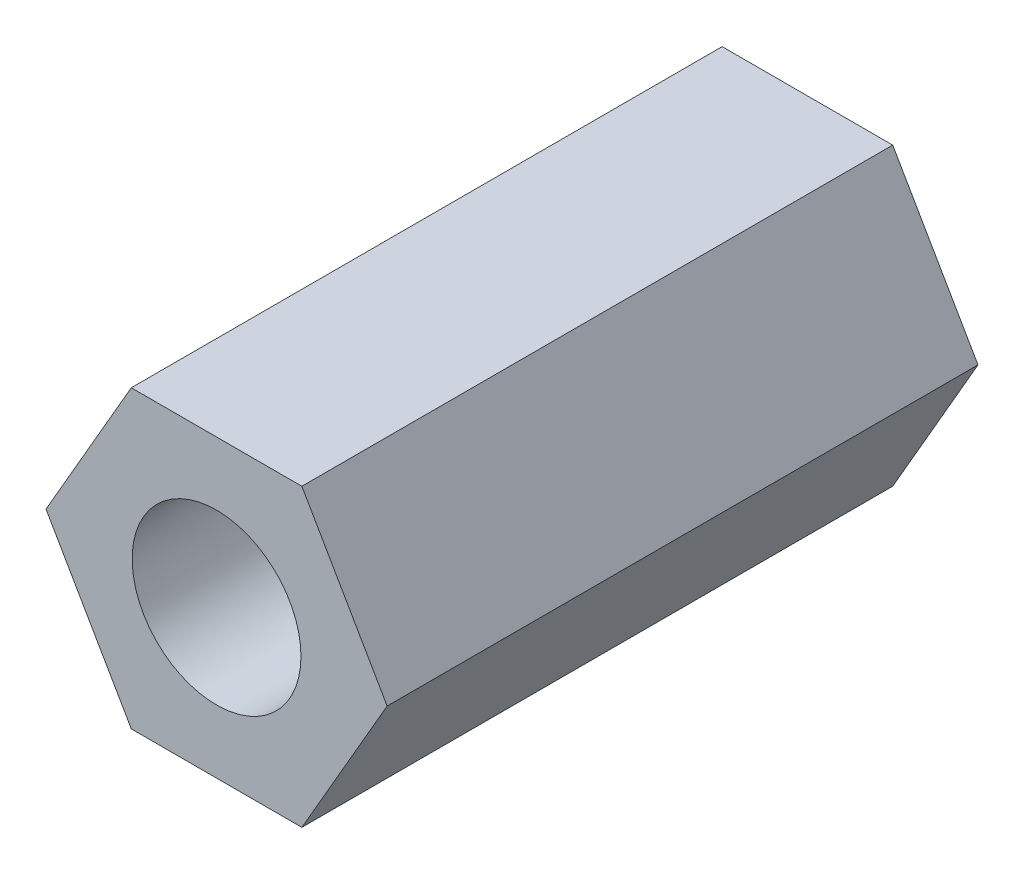
ISO-10303-21;
HEADER;
FILE_DESCRIPTION(('STEP AP214'),'2;1');
FILE_NAME('part.step','',(''),(''),'','','');
FILE_SCHEMA(('AUTOMOTIVE_DESIGN { 1 0 10303 214 1 1 1 1 }'));
ENDSEC;
DATA;
#1=APPLICATION_CONTEXT('core data for automotive mechanical design processes');
#2=APPLICATION_PROTOCOL_DEFINITION('international standard','automotive_design',2000,#1);
#3=PRODUCT_CONTEXT('',#1,'mechanical');
#4=PRODUCT('Part','Part','',(#3));
#5=PRODUCT_RELATED_PRODUCT_CATEGORY('part','',(#4));
#6=PRODUCT_DEFINITION_FORMATION('','',#4);
#7=PRODUCT_DEFINITION_CONTEXT('part definition',#1,'design');
#8=PRODUCT_DEFINITION('design','',#6,#7);
#9=PRODUCT_DEFINITION_SHAPE('','',#8);
#10=(LENGTH_UNIT() NAMED_UNIT(*) SI_UNIT(.MILLI.,.METRE.));
#11=(NAMED_UNIT(*) PLANE_ANGLE_UNIT() SI_UNIT($,.RADIAN.));
#12=(NAMED_UNIT(*) SI_UNIT($,.STERADIAN.) SOLID_ANGLE_UNIT());
#13=UNCERTAINTY_MEASURE_WITH_UNIT(LENGTH_MEASURE(1.E-05),#10,'distance_accuracy_value','');
#14=(GEOMETRIC_REPRESENTATION_CONTEXT(3) GLOBAL_UNCERTAINTY_ASSIGNED_CONTEXT((#13)) GLOBAL_UNIT_ASSIGNED_CONTEXT((#10,
#11,#12)) REPRESENTATION_CONTEXT('',''));
#15=CARTESIAN_POINT('',(0.,0.,0.));
#16=DIRECTION('',(0.,0.,1.));
#17=DIRECTION('',(1.,0.,0.));
#18=AXIS2_PLACEMENT_3D('',#15,#16,#17);
#19=CARTESIAN_POINT('',(4.04145188432739,0.,14.));
#20=DIRECTION('',(-0.866025403784439,-0.5,0.));
#21=DIRECTION('',(0.5,-0.866025403784439,0.));
#22=AXIS2_PLACEMENT_3D('',#19,#20,#21);
#23=PLANE('',#22);
#24=DIRECTION('',(-0.5,0.866025403784439,0.));
#25=VECTOR('',#24,1.);
#26=CARTESIAN_POINT('',(4.04145188432739,0.,0.));
#27=LINE('',#26,#25);
#28=CARTESIAN_POINT('',(4.04145188432739,0.,0.));
#29=VERTEX_POINT('',#28);
#30=CARTESIAN_POINT('',(2.02072594216369,3.5,0.));
#31=VERTEX_POINT('',#30);
#32=EDGE_CURVE('E117',#29,#31,#27,.T.);
#33=ORIENTED_EDGE('',*,*,#32,.T.);
#34=DIRECTION('',(0.,0.,-1.));
#35=VECTOR('',#34,1.);
#36=CARTESIAN_POINT('',(2.02072594216369,3.5,14.));
#37=LINE('',#36,#35);
#38=CARTESIAN_POINT('',(2.02072594216369,3.5,14.));
#39=VERTEX_POINT('',#38);
#40=EDGE_CURVE('E11',#39,#31,#37,.T.);
#41=ORIENTED_EDGE('',*,*,#40,.F.);
#42=DIRECTION('',(-0.5,0.866025403784439,0.));
#43=VECTOR('',#42,1.);
#44=CARTESIAN_POINT('',(4.04145188432739,0.,14.));
#45=LINE('',#44,#43);
#46=CARTESIAN_POINT('',(4.04145188432739,0.,14.));
#47=VERTEX_POINT('',#46);
#48=EDGE_CURVE('E127',#47,#39,#45,.T.);
#49=ORIENTED_EDGE('',*,*,#48,.F.);
#50=DIRECTION('',(0.,0.,-1.));
#51=VECTOR('',#50,1.);
#52=CARTESIAN_POINT('',(4.04145188432739,0.,14.));
#53=LINE('',#52,#51);
#54=EDGE_CURVE('E113',#47,#29,#53,.T.);
#55=ORIENTED_EDGE('',*,*,#54,.T.);
#56=EDGE_LOOP('',(#33,#41,#49,#55));
#57=FACE_BOUND('',#56,.T.);
#58=ADVANCED_FACE('F32',(#57),#23,.F.);
#59=CARTESIAN_POINT('',(2.02072594216369,3.5,14.));
#60=DIRECTION('',(0.,-1.,0.));
#61=DIRECTION('',(1.,0.,0.));
#62=AXIS2_PLACEMENT_3D('',#59,#60,#61);
#63=PLANE('',#62);
#64=DIRECTION('',(-1.,0.,0.));
#65=VECTOR('',#64,1.);
#66=CARTESIAN_POINT('',(2.02072594216369,3.5,0.));
#67=LINE('',#66,#65);
#68=CARTESIAN_POINT('',(-2.02072594216368,3.5,0.));
#69=VERTEX_POINT('',#68);
#70=EDGE_CURVE('E120',#31,#69,#67,.T.);
#71=ORIENTED_EDGE('',*,*,#70,.T.);
#72=DIRECTION('',(0.,0.,-1.));
#73=VECTOR('',#72,1.);
#74=CARTESIAN_POINT('',(-2.02072594216368,3.5,14.));
#75=LINE('',#74,#73);
#76=CARTESIAN_POINT('',(-2.02072594216368,3.5,14.));
#77=VERTEX_POINT('',#76);
#78=EDGE_CURVE('E41',#77,#69,#75,.T.);
#79=ORIENTED_EDGE('',*,*,#78,.F.);
#80=DIRECTION('',(-1.,0.,0.));
#81=VECTOR('',#80,1.);
#82=CARTESIAN_POINT('',(2.02072594216369,3.5,14.));
#83=LINE('',#82,#81);
#84=EDGE_CURVE('E86',#39,#77,#83,.T.);
#85=ORIENTED_EDGE('',*,*,#84,.F.);
#86=ORIENTED_EDGE('',*,*,#40,.T.);
#87=EDGE_LOOP('',(#71,#79,#85,#86));
#88=FACE_BOUND('',#87,.T.);
#89=ADVANCED_FACE('F153',(#88),#63,.F.);
#90=CARTESIAN_POINT('',(-2.02072594216368,3.5,14.));
#91=DIRECTION('',(0.866025403784439,-0.5,0.));
#92=DIRECTION('',(0.5,0.866025403784439,0.));
#93=AXIS2_PLACEMENT_3D('',#90,#91,#92);
#94=PLANE('',#93);
#95=DIRECTION('',(-0.5,-0.866025403784439,0.));
#96=VECTOR('',#95,1.);
#97=CARTESIAN_POINT('',(-2.02072594216368,3.5,0.));
#98=LINE('',#97,#96);
#99=CARTESIAN_POINT('',(-4.04145188432737,0.,0.));
#100=VERTEX_POINT('',#99);
#101=EDGE_CURVE('E122',#69,#100,#98,.T.);
#102=ORIENTED_EDGE('',*,*,#101,.T.);
#103=DIRECTION('',(0.,0.,-1.));
#104=VECTOR('',#103,1.);
#105=CARTESIAN_POINT('',(-4.04145188432737,0.,14.));
#106=LINE('',#105,#104);
#107=CARTESIAN_POINT('',(-4.04145188432737,0.,14.));
#108=VERTEX_POINT('',#107);
#109=EDGE_CURVE('E108',#108,#100,#106,.T.);
#110=ORIENTED_EDGE('',*,*,#109,.F.);
#111=DIRECTION('',(-0.5,-0.866025403784439,0.));
#112=VECTOR('',#111,1.);
#113=CARTESIAN_POINT('',(-2.02072594216368,3.5,14.));
#114=LINE('',#113,#112);
#115=EDGE_CURVE('E99',#77,#108,#114,.T.);
#116=ORIENTED_EDGE('',*,*,#115,.F.);
#117=ORIENTED_EDGE('',*,*,#78,.T.);
#118=EDGE_LOOP('',(#102,#110,#116,#117));
#119=FACE_BOUND('',#118,.T.);
#120=ADVANCED_FACE('F134',(#119),#94,.F.);
#121=CARTESIAN_POINT('',(-4.04145188432737,0.,14.));
#122=DIRECTION('',(0.866025403784439,0.5,0.));
#123=DIRECTION('',(-0.5,0.866025403784439,0.));
#124=AXIS2_PLACEMENT_3D('',#121,#122,#123);
#125=PLANE('',#124);
#126=DIRECTION('',(0.5,-0.866025403784439,0.));
#127=VECTOR('',#126,1.);
#128=CARTESIAN_POINT('',(-4.04145188432737,0.,0.));
#129=LINE('',#128,#127);
#130=CARTESIAN_POINT('',(-2.02072594216367,-3.50000000000001,0.));
#131=VERTEX_POINT('',#130);
#132=EDGE_CURVE('E107',#100,#131,#129,.T.);
#133=ORIENTED_EDGE('',*,*,#132,.T.);
#134=DIRECTION('',(0.,0.,-1.));
#135=VECTOR('',#134,1.);
#136=CARTESIAN_POINT('',(-2.02072594216367,-3.50000000000001,14.));
#137=LINE('',#136,#135);
#138=CARTESIAN_POINT('',(-2.02072594216367,-3.50000000000001,14.));
#139=VERTEX_POINT('',#138);
#140=EDGE_CURVE('E104',#139,#131,#137,.T.);
#141=ORIENTED_EDGE('',*,*,#140,.F.);
#142=DIRECTION('',(0.5,-0.866025403784439,0.));
#143=VECTOR('',#142,1.);
#144=CARTESIAN_POINT('',(-4.04145188432737,0.,14.));
#145=LINE('',#144,#143);
#146=EDGE_CURVE('E93',#108,#139,#145,.T.);
#147=ORIENTED_EDGE('',*,*,#146,.F.);
#148=ORIENTED_EDGE('',*,*,#109,.T.);
#149=EDGE_LOOP('',(#133,#141,#147,#148));
#150=FACE_BOUND('',#149,.T.);
#151=ADVANCED_FACE('F105',(#150),#125,.F.);
#152=CARTESIAN_POINT('',(-2.02072594216367,-3.50000000000001,14.));
#153=DIRECTION('',(0.,1.,0.));
#154=DIRECTION('',(-1.,0.,0.));
#155=AXIS2_PLACEMENT_3D('',#152,#153,#154);
#156=PLANE('',#155);
#157=DIRECTION('',(1.,0.,0.));
#158=VECTOR('',#157,1.);
#159=CARTESIAN_POINT('',(-2.02072594216367,-3.50000000000001,0.));
#160=LINE('',#159,#158);
#161=CARTESIAN_POINT('',(2.02072594216369,-3.50000000000001,0.));
#162=VERTEX_POINT('',#161);
#163=EDGE_CURVE('E72',#131,#162,#160,.T.);
#164=ORIENTED_EDGE('',*,*,#163,.T.);
#165=DIRECTION('',(0.,0.,-1.));
#166=VECTOR('',#165,1.);
#167=CARTESIAN_POINT('',(2.02072594216369,-3.50000000000001,14.));
#168=LINE('',#167,#166);
#169=CARTESIAN_POINT('',(2.02072594216369,-3.50000000000001,14.));
#170=VERTEX_POINT('',#169);
#171=EDGE_CURVE('E109',#170,#162,#168,.T.);
#172=ORIENTED_EDGE('',*,*,#171,.F.);
#173=DIRECTION('',(1.,0.,0.));
#174=VECTOR('',#173,1.);
#175=CARTESIAN_POINT('',(-2.02072594216367,-3.50000000000001,14.));
#176=LINE('',#175,#174);
#177=EDGE_CURVE('E97',#139,#170,#176,.T.);
#178=ORIENTED_EDGE('',*,*,#177,.F.);
#179=ORIENTED_EDGE('',*,*,#140,.T.);
#180=EDGE_LOOP('',(#164,#172,#178,#179));
#181=FACE_BOUND('',#180,.T.);
#182=ADVANCED_FACE('F111',(#181),#156,.F.);
#183=CARTESIAN_POINT('',(2.02072594216369,-3.50000000000001,14.));
#184=DIRECTION('',(-0.866025403784438,0.500000000000001,0.));
#185=DIRECTION('',(-0.500000000000001,-0.866025403784438,0.));
#186=AXIS2_PLACEMENT_3D('',#183,#184,#185);
#187=PLANE('',#186);
#188=DIRECTION('',(0.500000000000001,0.866025403784438,0.));
#189=VECTOR('',#188,1.);
#190=CARTESIAN_POINT('',(2.02072594216369,-3.50000000000001,0.));
#191=LINE('',#190,#189);
#192=EDGE_CURVE('E78',#162,#29,#191,.T.);
#193=ORIENTED_EDGE('',*,*,#192,.T.);
#194=ORIENTED_EDGE('',*,*,#54,.F.);
#195=DIRECTION('',(0.500000000000001,0.866025403784438,0.));
#196=VECTOR('',#195,1.);
#197=CARTESIAN_POINT('',(2.02072594216369,-3.50000000000001,14.));
#198=LINE('',#197,#196);
#199=EDGE_CURVE('E49',#170,#47,#198,.T.);
#200=ORIENTED_EDGE('',*,*,#199,.F.);
#201=ORIENTED_EDGE('',*,*,#171,.T.);
#202=EDGE_LOOP('',(#193,#194,#200,#201));
#203=FACE_BOUND('',#202,.T.);
#204=ADVANCED_FACE('F141',(#203),#187,.F.);
#205=CARTESIAN_POINT('',(0.,0.,14.));
#206=DIRECTION('',(0.,0.,1.));
#207=DIRECTION('',(1.,0.,0.));
#208=AXIS2_PLACEMENT_3D('',#205,#206,#207);
#209=PLANE('',#208);
#210=CARTESIAN_POINT('',(0.,0.,14.));
#211=DIRECTION('',(0.,0.,1.));
#212=DIRECTION('',(1.,0.,0.));
#213=AXIS2_PLACEMENT_3D('',#210,#211,#212);
#214=CIRCLE('',#213,2.);
#215=CARTESIAN_POINT('',(2.,0.,14.));
#216=VERTEX_POINT('',#215);
#217=EDGE_CURVE('E206',#216,#216,#214,.T.);
#218=ORIENTED_EDGE('',*,*,#217,.F.);
#219=EDGE_LOOP('',(#218));
#220=FACE_BOUND('',#219,.T.);
#221=ORIENTED_EDGE('',*,*,#48,.T.);
#222=ORIENTED_EDGE('',*,*,#84,.T.);
#223=ORIENTED_EDGE('',*,*,#115,.T.);
#224=ORIENTED_EDGE('',*,*,#146,.T.);
#225=ORIENTED_EDGE('',*,*,#177,.T.);
#226=ORIENTED_EDGE('',*,*,#199,.T.);
#227=EDGE_LOOP('',(#221,#222,#223,#224,#225,#226));
#228=FACE_BOUND('',#227,.T.);
#229=ADVANCED_FACE('F95',(#220,#228),#209,.T.);
#230=CARTESIAN_POINT('',(0.,0.,0.));
#231=DIRECTION('',(0.,0.,1.));
#232=DIRECTION('',(1.,0.,0.));
#233=AXIS2_PLACEMENT_3D('',#230,#231,#232);
#234=PLANE('',#233);
#235=CARTESIAN_POINT('',(0.,0.,0.));
#236=DIRECTION('',(0.,0.,1.));
#237=DIRECTION('',(1.,0.,0.));
#238=AXIS2_PLACEMENT_3D('',#235,#236,#237);
#239=CIRCLE('',#238,2.);
#240=CARTESIAN_POINT('',(2.,0.,0.));
#241=VERTEX_POINT('',#240);
#242=EDGE_CURVE('E35',#241,#241,#239,.T.);
#243=ORIENTED_EDGE('',*,*,#242,.T.);
#244=EDGE_LOOP('',(#243));
#245=FACE_BOUND('',#244,.T.);
#246=ORIENTED_EDGE('',*,*,#32,.F.);
#247=ORIENTED_EDGE('',*,*,#192,.F.);
#248=ORIENTED_EDGE('',*,*,#163,.F.);
#249=ORIENTED_EDGE('',*,*,#132,.F.);
#250=ORIENTED_EDGE('',*,*,#101,.F.);
#251=ORIENTED_EDGE('',*,*,#70,.F.);
#252=EDGE_LOOP('',(#246,#247,#248,#249,#250,#251));
#253=FACE_BOUND('',#252,.T.);
#254=ADVANCED_FACE('F137',(#245,#253),#234,.F.);
#255=CARTESIAN_POINT('',(0.,0.,-0.999999999999999));
#256=DIRECTION('',(0.,0.,1.));
#257=DIRECTION('',(1.,0.,0.));
#258=AXIS2_PLACEMENT_3D('',#255,#256,#257);
#259=CYLINDRICAL_SURFACE('',#258,2.);
#260=ORIENTED_EDGE('',*,*,#217,.T.);
#261=EDGE_LOOP('',(#260));
#262=FACE_BOUND('',#261,.T.);
#263=ORIENTED_EDGE('',*,*,#242,.F.);
#264=EDGE_LOOP('',(#263));
#265=FACE_BOUND('',#264,.T.);
#266=ADVANCED_FACE('F190',(#262,#265),#259,.F.);
#267=CLOSED_SHELL('',(#58,#89,#120,#151,#182,#204,#229,#254,#266));
#268=MANIFOLD_SOLID_BREP('B2',#267);
#269=ADVANCED_BREP_SHAPE_REPRESENTATION('',(#18,#268),#14);
#270=SHAPE_DEFINITION_REPRESENTATION(#9,#269);
ENDSEC;
END-ISO-10303-21;
